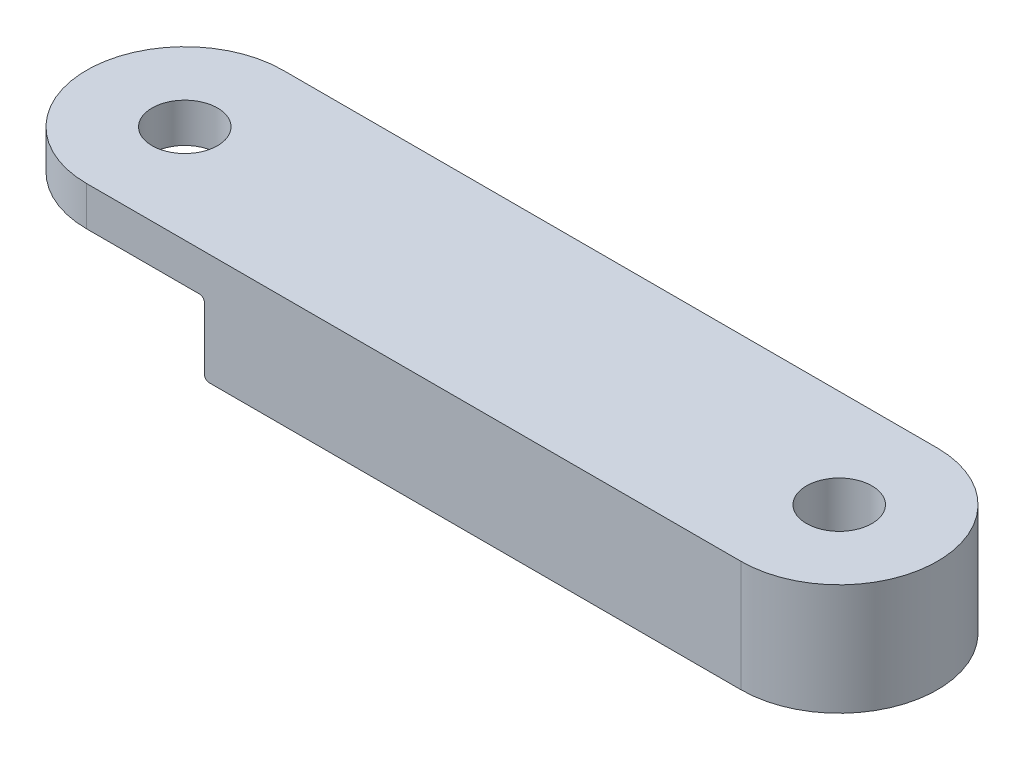
ISO-10303-21;
HEADER;
FILE_DESCRIPTION(('STEP AP214'),'2;1');
FILE_NAME('part.step','',(''),(''),'','','');
FILE_SCHEMA(('AUTOMOTIVE_DESIGN { 1 0 10303 214 1 1 1 1 }'));
ENDSEC;
DATA;
#1=APPLICATION_CONTEXT('core data for automotive mechanical design processes');
#2=APPLICATION_PROTOCOL_DEFINITION('international standard','automotive_design',2000,#1);
#3=PRODUCT_CONTEXT('',#1,'mechanical');
#4=PRODUCT('Part','Part','',(#3));
#5=PRODUCT_RELATED_PRODUCT_CATEGORY('part','',(#4));
#6=PRODUCT_DEFINITION_FORMATION('','',#4);
#7=PRODUCT_DEFINITION_CONTEXT('part definition',#1,'design');
#8=PRODUCT_DEFINITION('design','',#6,#7);
#9=PRODUCT_DEFINITION_SHAPE('','',#8);
#10=(LENGTH_UNIT() NAMED_UNIT(*) SI_UNIT(.MILLI.,.METRE.));
#11=(NAMED_UNIT(*) PLANE_ANGLE_UNIT() SI_UNIT($,.RADIAN.));
#12=(NAMED_UNIT(*) SI_UNIT($,.STERADIAN.) SOLID_ANGLE_UNIT());
#13=UNCERTAINTY_MEASURE_WITH_UNIT(LENGTH_MEASURE(1.E-05),#10,'distance_accuracy_value','');
#14=(GEOMETRIC_REPRESENTATION_CONTEXT(3) GLOBAL_UNCERTAINTY_ASSIGNED_CONTEXT((#13)) GLOBAL_UNIT_ASSIGNED_CONTEXT((#10,
#11,#12)) REPRESENTATION_CONTEXT('',''));
#15=CARTESIAN_POINT('',(0.,0.,0.));
#16=DIRECTION('',(0.,0.,1.));
#17=DIRECTION('',(1.,0.,0.));
#18=AXIS2_PLACEMENT_3D('',#15,#16,#17);
#19=CARTESIAN_POINT('',(-44.0992169585041,14.0577164419931,6.));
#20=DIRECTION('',(0.,0.,-1.));
#21=DIRECTION('',(-1.,0.,0.));
#22=AXIS2_PLACEMENT_3D('',#19,#20,#21);
#23=PLANE('',#22);
#24=DIRECTION('',(0.,-1.,0.));
#25=VECTOR('',#24,1.);
#26=CARTESIAN_POINT('',(-36.8992169585041,11.6577164419931,6.));
#27=LINE('',#26,#25);
#28=CARTESIAN_POINT('',(-36.8992169585041,11.3577164419931,6.));
#29=VERTEX_POINT('',#28);
#30=CARTESIAN_POINT('',(-36.8992169585041,7.55771644199306,6.));
#31=VERTEX_POINT('',#30);
#32=EDGE_CURVE('E176',#29,#31,#27,.T.);
#33=ORIENTED_EDGE('',*,*,#32,.T.);
#34=CARTESIAN_POINT('',(-36.5992169585041,7.55771644199306,6.));
#35=DIRECTION('',(0.,0.,-1.));
#36=DIRECTION('',(-1.,0.,0.));
#37=AXIS2_PLACEMENT_3D('',#34,#35,#36);
#38=CIRCLE('',#37,0.3);
#39=CARTESIAN_POINT('',(-36.5992169585041,7.25771644199306,6.));
#40=VERTEX_POINT('',#39);
#41=EDGE_CURVE('E65',#31,#40,#38,.F.);
#42=ORIENTED_EDGE('',*,*,#41,.T.);
#43=DIRECTION('',(-1.,0.,0.));
#44=VECTOR('',#43,1.);
#45=CARTESIAN_POINT('',(-44.0992169585041,7.25771644199306,6.));
#46=LINE('',#45,#44);
#47=CARTESIAN_POINT('',(-4.09921695850414,7.25771644199306,6.));
#48=VERTEX_POINT('',#47);
#49=EDGE_CURVE('E124',#48,#40,#46,.T.);
#50=ORIENTED_EDGE('',*,*,#49,.F.);
#51=DIRECTION('',(0.,-1.,0.));
#52=VECTOR('',#51,1.);
#53=CARTESIAN_POINT('',(-4.09921695850414,14.0577164419931,6.));
#54=LINE('',#53,#52);
#55=CARTESIAN_POINT('',(-4.09921695850414,14.0577164419931,6.));
#56=VERTEX_POINT('',#55);
#57=EDGE_CURVE('E122',#56,#48,#54,.T.);
#58=ORIENTED_EDGE('',*,*,#57,.F.);
#59=DIRECTION('',(1.,0.,0.));
#60=VECTOR('',#59,1.);
#61=CARTESIAN_POINT('',(-44.0992169585041,14.0577164419931,6.));
#62=LINE('',#61,#60);
#63=CARTESIAN_POINT('',(-44.0992169585041,14.0577164419931,6.));
#64=VERTEX_POINT('',#63);
#65=EDGE_CURVE('E189',#64,#56,#62,.T.);
#66=ORIENTED_EDGE('',*,*,#65,.F.);
#67=DIRECTION('',(0.,-1.,0.));
#68=VECTOR('',#67,1.);
#69=CARTESIAN_POINT('',(-44.0992169585041,14.0577164419931,6.));
#70=LINE('',#69,#68);
#71=CARTESIAN_POINT('',(-44.0992169585041,11.6577164419931,6.));
#72=VERTEX_POINT('',#71);
#73=EDGE_CURVE('E134',#64,#72,#70,.T.);
#74=ORIENTED_EDGE('',*,*,#73,.T.);
#75=DIRECTION('',(1.,0.,0.));
#76=VECTOR('',#75,1.);
#77=CARTESIAN_POINT('',(-44.0992169585041,11.6577164419931,6.));
#78=LINE('',#77,#76);
#79=CARTESIAN_POINT('',(-37.1992169585041,11.6577164419931,6.));
#80=VERTEX_POINT('',#79);
#81=EDGE_CURVE('E209',#72,#80,#78,.T.);
#82=ORIENTED_EDGE('',*,*,#81,.T.);
#83=CARTESIAN_POINT('',(-37.1992169585041,11.3577164419931,6.));
#84=DIRECTION('',(0.,0.,-1.));
#85=DIRECTION('',(-1.,0.,0.));
#86=AXIS2_PLACEMENT_3D('',#83,#84,#85);
#87=CIRCLE('',#86,0.3);
#88=EDGE_CURVE('E162',#80,#29,#87,.T.);
#89=ORIENTED_EDGE('',*,*,#88,.T.);
#90=EDGE_LOOP('',(#33,#42,#50,#58,#66,#74,#82,#89));
#91=FACE_BOUND('',#90,.T.);
#92=ADVANCED_FACE('F42',(#91),#23,.F.);
#93=CARTESIAN_POINT('',(-4.09921695850414,14.0577164419931,0.));
#94=DIRECTION('',(0.,-1.,0.));
#95=DIRECTION('',(0.,0.,-1.));
#96=AXIS2_PLACEMENT_3D('',#93,#94,#95);
#97=CYLINDRICAL_SURFACE('',#96,6.);
#98=CARTESIAN_POINT('',(-4.09921695850414,7.25771644199306,0.));
#99=DIRECTION('',(0.,-1.,0.));
#100=DIRECTION('',(0.,0.,-1.));
#101=AXIS2_PLACEMENT_3D('',#98,#99,#100);
#102=CIRCLE('',#101,6.);
#103=CARTESIAN_POINT('',(-4.09921695850414,7.25771644199306,-6.));
#104=VERTEX_POINT('',#103);
#105=EDGE_CURVE('E107',#104,#48,#102,.T.);
#106=ORIENTED_EDGE('',*,*,#105,.F.);
#107=DIRECTION('',(0.,-1.,0.));
#108=VECTOR('',#107,1.);
#109=CARTESIAN_POINT('',(-4.09921695850414,14.0577164419931,-6.));
#110=LINE('',#109,#108);
#111=CARTESIAN_POINT('',(-4.09921695850414,14.0577164419931,-6.));
#112=VERTEX_POINT('',#111);
#113=EDGE_CURVE('E119',#112,#104,#110,.T.);
#114=ORIENTED_EDGE('',*,*,#113,.F.);
#115=CARTESIAN_POINT('',(-4.09921695850414,14.0577164419931,0.));
#116=DIRECTION('',(0.,1.,0.));
#117=DIRECTION('',(0.,0.,1.));
#118=AXIS2_PLACEMENT_3D('',#115,#116,#117);
#119=CIRCLE('',#118,6.);
#120=EDGE_CURVE('E197',#56,#112,#119,.T.);
#121=ORIENTED_EDGE('',*,*,#120,.F.);
#122=ORIENTED_EDGE('',*,*,#57,.T.);
#123=EDGE_LOOP('',(#106,#114,#121,#122));
#124=FACE_BOUND('',#123,.T.);
#125=ADVANCED_FACE('F117',(#124),#97,.T.);
#126=CARTESIAN_POINT('',(-44.0992169585041,14.0577164419931,-6.));
#127=DIRECTION('',(0.,0.,1.));
#128=DIRECTION('',(1.,0.,0.));
#129=AXIS2_PLACEMENT_3D('',#126,#127,#128);
#130=PLANE('',#129);
#131=DIRECTION('',(1.,0.,0.));
#132=VECTOR('',#131,1.);
#133=CARTESIAN_POINT('',(-44.0992169585041,7.25771644199306,-6.));
#134=LINE('',#133,#132);
#135=CARTESIAN_POINT('',(-36.5992169585041,7.25771644199306,-6.));
#136=VERTEX_POINT('',#135);
#137=EDGE_CURVE('E104',#136,#104,#134,.T.);
#138=ORIENTED_EDGE('',*,*,#137,.F.);
#139=CARTESIAN_POINT('',(-36.5992169585041,7.55771644199306,-6.));
#140=DIRECTION('',(0.,0.,1.));
#141=DIRECTION('',(1.,0.,0.));
#142=AXIS2_PLACEMENT_3D('',#139,#140,#141);
#143=CIRCLE('',#142,0.3);
#144=CARTESIAN_POINT('',(-36.8992169585041,7.55771644199306,-6.));
#145=VERTEX_POINT('',#144);
#146=EDGE_CURVE('E11',#136,#145,#143,.F.);
#147=ORIENTED_EDGE('',*,*,#146,.T.);
#148=DIRECTION('',(0.,-1.,0.));
#149=VECTOR('',#148,1.);
#150=CARTESIAN_POINT('',(-36.8992169585041,11.6577164419931,-6.));
#151=LINE('',#150,#149);
#152=CARTESIAN_POINT('',(-36.8992169585041,11.3577164419931,-6.));
#153=VERTEX_POINT('',#152);
#154=EDGE_CURVE('E179',#153,#145,#151,.T.);
#155=ORIENTED_EDGE('',*,*,#154,.F.);
#156=CARTESIAN_POINT('',(-37.1992169585041,11.3577164419931,-6.));
#157=DIRECTION('',(0.,0.,1.));
#158=DIRECTION('',(1.,0.,0.));
#159=AXIS2_PLACEMENT_3D('',#156,#157,#158);
#160=CIRCLE('',#159,0.3);
#161=CARTESIAN_POINT('',(-37.1992169585041,11.6577164419931,-6.));
#162=VERTEX_POINT('',#161);
#163=EDGE_CURVE('E159',#153,#162,#160,.T.);
#164=ORIENTED_EDGE('',*,*,#163,.T.);
#165=DIRECTION('',(-1.,0.,0.));
#166=VECTOR('',#165,1.);
#167=CARTESIAN_POINT('',(-44.0992169585041,11.6577164419931,-6.));
#168=LINE('',#167,#166);
#169=CARTESIAN_POINT('',(-44.0992169585041,11.6577164419931,-6.));
#170=VERTEX_POINT('',#169);
#171=EDGE_CURVE('E191',#162,#170,#168,.T.);
#172=ORIENTED_EDGE('',*,*,#171,.T.);
#173=DIRECTION('',(0.,-1.,0.));
#174=VECTOR('',#173,1.);
#175=CARTESIAN_POINT('',(-44.0992169585041,14.0577164419931,-6.));
#176=LINE('',#175,#174);
#177=CARTESIAN_POINT('',(-44.0992169585041,14.0577164419931,-6.));
#178=VERTEX_POINT('',#177);
#179=EDGE_CURVE('E130',#178,#170,#176,.T.);
#180=ORIENTED_EDGE('',*,*,#179,.F.);
#181=DIRECTION('',(-1.,0.,0.));
#182=VECTOR('',#181,1.);
#183=CARTESIAN_POINT('',(-44.0992169585041,14.0577164419931,-6.));
#184=LINE('',#183,#182);
#185=EDGE_CURVE('E128',#112,#178,#184,.T.);
#186=ORIENTED_EDGE('',*,*,#185,.F.);
#187=ORIENTED_EDGE('',*,*,#113,.T.);
#188=EDGE_LOOP('',(#138,#147,#155,#164,#172,#180,#186,#187));
#189=FACE_BOUND('',#188,.T.);
#190=ADVANCED_FACE('F126',(#189),#130,.F.);
#191=CARTESIAN_POINT('',(-36.8992169585041,11.6577164419931,-6.));
#192=DIRECTION('',(-1.,0.,0.));
#193=DIRECTION('',(0.,0.,1.));
#194=AXIS2_PLACEMENT_3D('',#191,#192,#193);
#195=PLANE('',#194);
#196=ORIENTED_EDGE('',*,*,#154,.T.);
#197=DIRECTION('',(0.,0.,1.));
#198=VECTOR('',#197,1.);
#199=CARTESIAN_POINT('',(-36.8992169585041,7.55771644199306,-6.));
#200=LINE('',#199,#198);
#201=EDGE_CURVE('E165',#145,#31,#200,.T.);
#202=ORIENTED_EDGE('',*,*,#201,.T.);
#203=ORIENTED_EDGE('',*,*,#32,.F.);
#204=DIRECTION('',(0.,0.,-1.));
#205=VECTOR('',#204,1.);
#206=CARTESIAN_POINT('',(-36.8992169585041,11.3577164419931,-6.));
#207=LINE('',#206,#205);
#208=EDGE_CURVE('E143',#29,#153,#207,.T.);
#209=ORIENTED_EDGE('',*,*,#208,.T.);
#210=EDGE_LOOP('',(#196,#202,#203,#209));
#211=FACE_BOUND('',#210,.T.);
#212=ADVANCED_FACE('F175',(#211),#195,.T.);
#213=CARTESIAN_POINT('',(-4.09921695850414,6.05771644199306,0.));
#214=DIRECTION('',(0.,1.,0.));
#215=DIRECTION('',(0.,0.,1.));
#216=AXIS2_PLACEMENT_3D('',#213,#214,#215);
#217=CYLINDRICAL_SURFACE('',#216,2.);
#218=CARTESIAN_POINT('',(-4.09921695850414,14.0577164419931,0.));
#219=DIRECTION('',(0.,1.,0.));
#220=DIRECTION('',(0.,0.,1.));
#221=AXIS2_PLACEMENT_3D('',#218,#219,#220);
#222=CIRCLE('',#221,2.);
#223=CARTESIAN_POINT('',(-4.09921695850414,14.0577164419931,2.));
#224=VERTEX_POINT('',#223);
#225=EDGE_CURVE('E211',#224,#224,#222,.T.);
#226=ORIENTED_EDGE('',*,*,#225,.T.);
#227=EDGE_LOOP('',(#226));
#228=FACE_BOUND('',#227,.T.);
#229=CARTESIAN_POINT('',(-4.09921695850414,7.25771644199306,0.));
#230=DIRECTION('',(0.,-1.,0.));
#231=DIRECTION('',(0.,0.,-1.));
#232=AXIS2_PLACEMENT_3D('',#229,#230,#231);
#233=CIRCLE('',#232,2.);
#234=CARTESIAN_POINT('',(-4.09921695850414,7.25771644199306,-2.));
#235=VERTEX_POINT('',#234);
#236=EDGE_CURVE('E112',#235,#235,#233,.F.);
#237=ORIENTED_EDGE('',*,*,#236,.F.);
#238=EDGE_LOOP('',(#237));
#239=FACE_BOUND('',#238,.T.);
#240=ADVANCED_FACE('F231',(#228,#239),#217,.F.);
#241=CARTESIAN_POINT('',(-44.0992169585041,14.0577164419931,0.));
#242=DIRECTION('',(0.,1.,0.));
#243=DIRECTION('',(0.,0.,1.));
#244=AXIS2_PLACEMENT_3D('',#241,#242,#243);
#245=PLANE('',#244);
#246=CARTESIAN_POINT('',(-44.0992169585041,14.0577164419931,0.));
#247=DIRECTION('',(0.,1.,0.));
#248=DIRECTION('',(0.,0.,1.));
#249=AXIS2_PLACEMENT_3D('',#246,#247,#248);
#250=CIRCLE('',#249,2.);
#251=CARTESIAN_POINT('',(-44.0992169585041,14.0577164419931,2.));
#252=VERTEX_POINT('',#251);
#253=EDGE_CURVE('E149',#252,#252,#250,.T.);
#254=ORIENTED_EDGE('',*,*,#253,.F.);
#255=EDGE_LOOP('',(#254));
#256=FACE_BOUND('',#255,.T.);
#257=ORIENTED_EDGE('',*,*,#225,.F.);
#258=EDGE_LOOP('',(#257));
#259=FACE_BOUND('',#258,.T.);
#260=CARTESIAN_POINT('',(-44.0992169585041,14.0577164419931,0.));
#261=DIRECTION('',(0.,1.,0.));
#262=DIRECTION('',(0.,0.,1.));
#263=AXIS2_PLACEMENT_3D('',#260,#261,#262);
#264=CIRCLE('',#263,6.);
#265=EDGE_CURVE('E184',#178,#64,#264,.T.);
#266=ORIENTED_EDGE('',*,*,#265,.T.);
#267=ORIENTED_EDGE('',*,*,#65,.T.);
#268=ORIENTED_EDGE('',*,*,#120,.T.);
#269=ORIENTED_EDGE('',*,*,#185,.T.);
#270=EDGE_LOOP('',(#266,#267,#268,#269));
#271=FACE_BOUND('',#270,.T.);
#272=ADVANCED_FACE('F201',(#256,#259,#271),#245,.T.);
#273=CARTESIAN_POINT('',(-44.0992169585041,14.0577164419931,0.));
#274=DIRECTION('',(0.,-1.,0.));
#275=DIRECTION('',(0.,0.,-1.));
#276=AXIS2_PLACEMENT_3D('',#273,#274,#275);
#277=CYLINDRICAL_SURFACE('',#276,6.);
#278=ORIENTED_EDGE('',*,*,#179,.T.);
#279=CARTESIAN_POINT('',(-44.0992169585041,11.6577164419931,0.));
#280=DIRECTION('',(0.,1.,0.));
#281=DIRECTION('',(0.,0.,1.));
#282=AXIS2_PLACEMENT_3D('',#279,#280,#281);
#283=CIRCLE('',#282,6.);
#284=EDGE_CURVE('E148',#170,#72,#283,.T.);
#285=ORIENTED_EDGE('',*,*,#284,.T.);
#286=ORIENTED_EDGE('',*,*,#73,.F.);
#287=ORIENTED_EDGE('',*,*,#265,.F.);
#288=EDGE_LOOP('',(#278,#285,#286,#287));
#289=FACE_BOUND('',#288,.T.);
#290=ADVANCED_FACE('F208',(#289),#277,.T.);
#291=CARTESIAN_POINT('',(-44.0992169585041,11.6577164419931,0.));
#292=DIRECTION('',(0.,1.,0.));
#293=DIRECTION('',(0.,0.,1.));
#294=AXIS2_PLACEMENT_3D('',#291,#292,#293);
#295=PLANE('',#294);
#296=CARTESIAN_POINT('',(-44.0992169585041,11.6577164419931,0.));
#297=DIRECTION('',(0.,1.,0.));
#298=DIRECTION('',(0.,0.,1.));
#299=AXIS2_PLACEMENT_3D('',#296,#297,#298);
#300=CIRCLE('',#299,2.);
#301=CARTESIAN_POINT('',(-44.0992169585041,11.6577164419931,2.));
#302=VERTEX_POINT('',#301);
#303=EDGE_CURVE('E144',#302,#302,#300,.T.);
#304=ORIENTED_EDGE('',*,*,#303,.T.);
#305=EDGE_LOOP('',(#304));
#306=FACE_BOUND('',#305,.T.);
#307=ORIENTED_EDGE('',*,*,#171,.F.);
#308=DIRECTION('',(0.,0.,-1.));
#309=VECTOR('',#308,1.);
#310=CARTESIAN_POINT('',(-37.1992169585041,11.6577164419931,0.));
#311=LINE('',#310,#309);
#312=EDGE_CURVE('E156',#162,#80,#311,.F.);
#313=ORIENTED_EDGE('',*,*,#312,.T.);
#314=ORIENTED_EDGE('',*,*,#81,.F.);
#315=ORIENTED_EDGE('',*,*,#284,.F.);
#316=EDGE_LOOP('',(#307,#313,#314,#315));
#317=FACE_BOUND('',#316,.T.);
#318=ADVANCED_FACE('F248',(#306,#317),#295,.F.);
#319=CARTESIAN_POINT('',(-44.0992169585041,6.05771644199306,0.));
#320=DIRECTION('',(0.,1.,0.));
#321=DIRECTION('',(0.,0.,1.));
#322=AXIS2_PLACEMENT_3D('',#319,#320,#321);
#323=CYLINDRICAL_SURFACE('',#322,2.);
#324=ORIENTED_EDGE('',*,*,#253,.T.);
#325=EDGE_LOOP('',(#324));
#326=FACE_BOUND('',#325,.T.);
#327=ORIENTED_EDGE('',*,*,#303,.F.);
#328=EDGE_LOOP('',(#327));
#329=FACE_BOUND('',#328,.T.);
#330=ADVANCED_FACE('F226',(#326,#329),#323,.F.);
#331=CARTESIAN_POINT('',(0.,7.25771644199306,0.));
#332=DIRECTION('',(0.,-1.,0.));
#333=DIRECTION('',(0.,0.,-1.));
#334=AXIS2_PLACEMENT_3D('',#331,#332,#333);
#335=PLANE('',#334);
#336=ORIENTED_EDGE('',*,*,#236,.T.);
#337=EDGE_LOOP('',(#336));
#338=FACE_BOUND('',#337,.T.);
#339=ORIENTED_EDGE('',*,*,#49,.T.);
#340=DIRECTION('',(0.,0.,1.));
#341=VECTOR('',#340,1.);
#342=CARTESIAN_POINT('',(-36.5992169585041,7.25771644199306,0.));
#343=LINE('',#342,#341);
#344=EDGE_CURVE('E51',#40,#136,#343,.F.);
#345=ORIENTED_EDGE('',*,*,#344,.T.);
#346=ORIENTED_EDGE('',*,*,#137,.T.);
#347=ORIENTED_EDGE('',*,*,#105,.T.);
#348=EDGE_LOOP('',(#339,#345,#346,#347));
#349=FACE_BOUND('',#348,.T.);
#350=ADVANCED_FACE('F106',(#338,#349),#335,.T.);
#351=CARTESIAN_POINT('',(-37.1992169585041,11.3577164419931,-6.));
#352=DIRECTION('',(0.,0.,-1.));
#353=DIRECTION('',(-1.,0.,0.));
#354=AXIS2_PLACEMENT_3D('',#351,#352,#353);
#355=CYLINDRICAL_SURFACE('',#354,0.3);
#356=ORIENTED_EDGE('',*,*,#88,.F.);
#357=ORIENTED_EDGE('',*,*,#312,.F.);
#358=ORIENTED_EDGE('',*,*,#163,.F.);
#359=ORIENTED_EDGE('',*,*,#208,.F.);
#360=EDGE_LOOP('',(#356,#357,#358,#359));
#361=FACE_BOUND('',#360,.T.);
#362=ADVANCED_FACE('F241',(#361),#355,.F.);
#363=CARTESIAN_POINT('',(-36.5992169585041,7.55771644199306,-6.));
#364=DIRECTION('',(0.,0.,1.));
#365=DIRECTION('',(1.,0.,0.));
#366=AXIS2_PLACEMENT_3D('',#363,#364,#365);
#367=CYLINDRICAL_SURFACE('',#366,0.3);
#368=ORIENTED_EDGE('',*,*,#146,.F.);
#369=ORIENTED_EDGE('',*,*,#344,.F.);
#370=ORIENTED_EDGE('',*,*,#41,.F.);
#371=ORIENTED_EDGE('',*,*,#201,.F.);
#372=EDGE_LOOP('',(#368,#369,#370,#371));
#373=FACE_BOUND('',#372,.T.);
#374=ADVANCED_FACE('F44',(#373),#367,.T.);
#375=CLOSED_SHELL('',(#92,#125,#190,#212,#240,#272,#290,#318,#330,#350,#362,#374));
#376=MANIFOLD_SOLID_BREP('B2',#375);
#377=ADVANCED_BREP_SHAPE_REPRESENTATION('',(#18,#376),#14);
#378=SHAPE_DEFINITION_REPRESENTATION(#9,#377);
ENDSEC;
END-ISO-10303-21;
